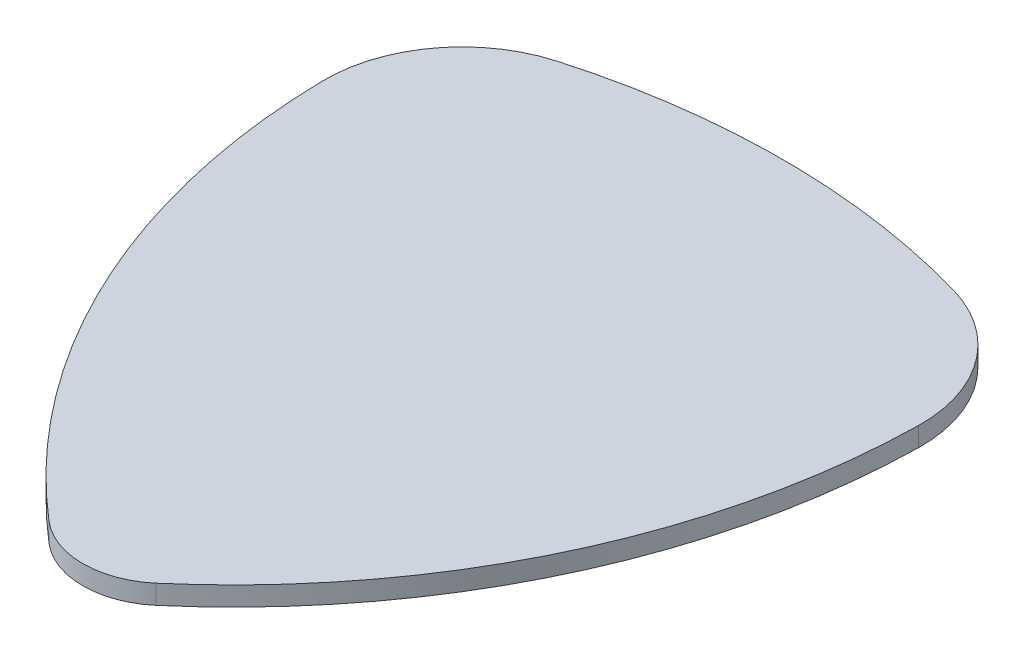
ISO-10303-21;
HEADER;
FILE_DESCRIPTION(('STEP AP214'),'2;1');
FILE_NAME('part.step','',(''),(''),'','','');
FILE_SCHEMA(('AUTOMOTIVE_DESIGN { 1 0 10303 214 1 1 1 1 }'));
ENDSEC;
DATA;
#1=APPLICATION_CONTEXT('core data for automotive mechanical design processes');
#2=APPLICATION_PROTOCOL_DEFINITION('international standard','automotive_design',2000,#1);
#3=PRODUCT_CONTEXT('',#1,'mechanical');
#4=PRODUCT('Part','Part','',(#3));
#5=PRODUCT_RELATED_PRODUCT_CATEGORY('part','',(#4));
#6=PRODUCT_DEFINITION_FORMATION('','',#4);
#7=PRODUCT_DEFINITION_CONTEXT('part definition',#1,'design');
#8=PRODUCT_DEFINITION('design','',#6,#7);
#9=PRODUCT_DEFINITION_SHAPE('','',#8);
#10=(LENGTH_UNIT() NAMED_UNIT(*) SI_UNIT(.MILLI.,.METRE.));
#11=(NAMED_UNIT(*) PLANE_ANGLE_UNIT() SI_UNIT($,.RADIAN.));
#12=(NAMED_UNIT(*) SI_UNIT($,.STERADIAN.) SOLID_ANGLE_UNIT());
#13=UNCERTAINTY_MEASURE_WITH_UNIT(LENGTH_MEASURE(1.E-05),#10,'distance_accuracy_value','');
#14=(GEOMETRIC_REPRESENTATION_CONTEXT(3) GLOBAL_UNCERTAINTY_ASSIGNED_CONTEXT((#13)) GLOBAL_UNIT_ASSIGNED_CONTEXT((#10,
#11,#12)) REPRESENTATION_CONTEXT('',''));
#15=CARTESIAN_POINT('',(0.,0.,0.));
#16=DIRECTION('',(0.,0.,1.));
#17=DIRECTION('',(1.,0.,0.));
#18=AXIS2_PLACEMENT_3D('',#15,#16,#17);
#19=CARTESIAN_POINT('',(28.0686505742078,0.77,2.07575299796898));
#20=DIRECTION('',(0.,-1.,0.));
#21=DIRECTION('',(0.,0.,-1.));
#22=AXIS2_PLACEMENT_3D('',#19,#20,#21);
#23=CYLINDRICAL_SURFACE('',#22,30.4413324660989);
#24=CARTESIAN_POINT('',(28.0686505742078,-0.07,2.07575299796898));
#25=DIRECTION('',(0.,1.,0.));
#26=DIRECTION('',(0.,0.,1.));
#27=AXIS2_PLACEMENT_3D('',#24,#25,#26);
#28=CIRCLE('',#27,30.4413324660989);
#29=CARTESIAN_POINT('',(-2.36769348749957,-0.07,2.62682692126694));
#30=VERTEX_POINT('',#29);
#31=CARTESIAN_POINT('',(8.31566643750851,-0.07,25.2381004611877));
#32=VERTEX_POINT('',#31);
#33=EDGE_CURVE('E113',#30,#32,#28,.T.);
#34=ORIENTED_EDGE('',*,*,#33,.T.);
#35=DIRECTION('',(0.,-1.,0.));
#36=VECTOR('',#35,1.);
#37=CARTESIAN_POINT('',(8.3156664375085,0.77,25.2381004611877));
#38=LINE('',#37,#36);
#39=CARTESIAN_POINT('',(8.31566643750851,0.77,25.2381004611877));
#40=VERTEX_POINT('',#39);
#41=EDGE_CURVE('E42',#32,#40,#38,.F.);
#42=ORIENTED_EDGE('',*,*,#41,.T.);
#43=CARTESIAN_POINT('',(28.0686505742078,0.77,2.07575299796898));
#44=DIRECTION('',(0.,1.,0.));
#45=DIRECTION('',(0.,0.,1.));
#46=AXIS2_PLACEMENT_3D('',#43,#44,#45);
#47=CIRCLE('',#46,30.4413324660989);
#48=CARTESIAN_POINT('',(-2.36769348749957,0.77,2.62682692126694));
#49=VERTEX_POINT('',#48);
#50=EDGE_CURVE('E108',#49,#40,#47,.T.);
#51=ORIENTED_EDGE('',*,*,#50,.F.);
#52=DIRECTION('',(0.,-1.,0.));
#53=VECTOR('',#52,1.);
#54=CARTESIAN_POINT('',(-2.36769348749957,0.77,2.62682692126694));
#55=LINE('',#54,#53);
#56=EDGE_CURVE('E120',#49,#30,#55,.T.);
#57=ORIENTED_EDGE('',*,*,#56,.T.);
#58=EDGE_LOOP('',(#34,#42,#51,#57));
#59=FACE_BOUND('',#58,.T.);
#60=ADVANCED_FACE('F34',(#59),#23,.T.);
#61=CARTESIAN_POINT('',(-6.7653314797104,0.77,2.07575299796898));
#62=DIRECTION('',(0.,-1.,0.));
#63=DIRECTION('',(0.,0.,-1.));
#64=AXIS2_PLACEMENT_3D('',#61,#62,#63);
#65=CYLINDRICAL_SURFACE('',#64,30.4413324660989);
#66=CARTESIAN_POINT('',(-6.7653314797104,0.77,2.07575299796898));
#67=DIRECTION('',(0.,1.,0.));
#68=DIRECTION('',(0.,0.,-1.));
#69=AXIS2_PLACEMENT_3D('',#66,#67,#68);
#70=CIRCLE('',#69,30.4413324660989);
#71=CARTESIAN_POINT('',(12.9876526569889,0.77,25.2381004611877));
#72=VERTEX_POINT('',#71);
#73=CARTESIAN_POINT('',(23.671012581997,0.77,2.62682692126694));
#74=VERTEX_POINT('',#73);
#75=EDGE_CURVE('E111',#72,#74,#70,.T.);
#76=ORIENTED_EDGE('',*,*,#75,.F.);
#77=DIRECTION('',(0.,-1.,0.));
#78=VECTOR('',#77,1.);
#79=CARTESIAN_POINT('',(12.9876526569889,0.77,25.2381004611877));
#80=LINE('',#79,#78);
#81=CARTESIAN_POINT('',(12.9876526569889,-0.07,25.2381004611877));
#82=VERTEX_POINT('',#81);
#83=EDGE_CURVE('E128',#72,#82,#80,.T.);
#84=ORIENTED_EDGE('',*,*,#83,.T.);
#85=CARTESIAN_POINT('',(-6.7653314797104,-0.07,2.07575299796898));
#86=DIRECTION('',(0.,1.,0.));
#87=DIRECTION('',(0.,0.,-1.));
#88=AXIS2_PLACEMENT_3D('',#85,#86,#87);
#89=CIRCLE('',#88,30.4413324660989);
#90=CARTESIAN_POINT('',(23.671012581997,-0.07,2.62682692126694));
#91=VERTEX_POINT('',#90);
#92=EDGE_CURVE('E109',#82,#91,#89,.T.);
#93=ORIENTED_EDGE('',*,*,#92,.T.);
#94=DIRECTION('',(0.,-1.,0.));
#95=VECTOR('',#94,1.);
#96=CARTESIAN_POINT('',(23.671012581997,0.77,2.62682692126694));
#97=LINE('',#96,#95);
#98=EDGE_CURVE('E94',#91,#74,#97,.F.);
#99=ORIENTED_EDGE('',*,*,#98,.T.);
#100=EDGE_LOOP('',(#76,#84,#93,#99));
#101=FACE_BOUND('',#100,.T.);
#102=ADVANCED_FACE('F134',(#101),#65,.T.);
#103=CARTESIAN_POINT('',(10.6516595472487,0.77,27.0421933905919));
#104=DIRECTION('',(0.,-1.,0.));
#105=DIRECTION('',(0.,0.,-1.));
#106=AXIS2_PLACEMENT_3D('',#103,#104,#105);
#107=CYLINDRICAL_SURFACE('',#106,31.5090353009912);
#108=CARTESIAN_POINT('',(10.6516595472487,-0.07,27.0421933905919));
#109=DIRECTION('',(0.,1.,0.));
#110=DIRECTION('',(0.,0.,-1.));
#111=AXIS2_PLACEMENT_3D('',#108,#109,#110);
#112=CIRCLE('',#111,31.5090353009912);
#113=CARTESIAN_POINT('',(19.3232545394361,-0.07,-3.25009516426281));
#114=VERTEX_POINT('',#113);
#115=CARTESIAN_POINT('',(1.98006455506132,-0.07,-3.25009516426281));
#116=VERTEX_POINT('',#115);
#117=EDGE_CURVE('E101',#114,#116,#112,.T.);
#118=ORIENTED_EDGE('',*,*,#117,.T.);
#119=DIRECTION('',(0.,-1.,0.));
#120=VECTOR('',#119,1.);
#121=CARTESIAN_POINT('',(1.98006455506132,0.77,-3.25009516426281));
#122=LINE('',#121,#120);
#123=CARTESIAN_POINT('',(1.98006455506132,0.77,-3.25009516426281));
#124=VERTEX_POINT('',#123);
#125=EDGE_CURVE('E124',#116,#124,#122,.F.);
#126=ORIENTED_EDGE('',*,*,#125,.T.);
#127=CARTESIAN_POINT('',(10.6516595472487,0.77,27.0421933905919));
#128=DIRECTION('',(0.,1.,0.));
#129=DIRECTION('',(0.,0.,-1.));
#130=AXIS2_PLACEMENT_3D('',#127,#128,#129);
#131=CIRCLE('',#130,31.5090353009912);
#132=CARTESIAN_POINT('',(19.3232545394361,0.77,-3.25009516426281));
#133=VERTEX_POINT('',#132);
#134=EDGE_CURVE('E104',#133,#124,#131,.T.);
#135=ORIENTED_EDGE('',*,*,#134,.F.);
#136=DIRECTION('',(0.,-1.,0.));
#137=VECTOR('',#136,1.);
#138=CARTESIAN_POINT('',(19.3232545394361,0.77,-3.25009516426281));
#139=LINE('',#138,#137);
#140=EDGE_CURVE('E92',#133,#114,#139,.T.);
#141=ORIENTED_EDGE('',*,*,#140,.T.);
#142=EDGE_LOOP('',(#118,#126,#135,#141));
#143=FACE_BOUND('',#142,.T.);
#144=ADVANCED_FACE('F100',(#143),#107,.T.);
#145=CARTESIAN_POINT('',(10.6516595472487,0.77,2.07575299796898));
#146=DIRECTION('',(0.,1.,0.));
#147=DIRECTION('',(0.,0.,1.));
#148=AXIS2_PLACEMENT_3D('',#145,#146,#147);
#149=PLANE('',#148);
#150=ORIENTED_EDGE('',*,*,#50,.T.);
#151=CARTESIAN_POINT('',(10.6516595472487,0.77,22.4989151459441));
#152=DIRECTION('',(0.,1.,0.));
#153=DIRECTION('',(0.,0.,1.));
#154=AXIS2_PLACEMENT_3D('',#151,#152,#153);
#155=CIRCLE('',#154,3.6);
#156=EDGE_CURVE('E11',#40,#72,#155,.T.);
#157=ORIENTED_EDGE('',*,*,#156,.T.);
#158=ORIENTED_EDGE('',*,*,#75,.T.);
#159=CARTESIAN_POINT('',(17.6719957986936,0.77,2.51821000893335));
#160=DIRECTION('',(0.,1.,0.));
#161=DIRECTION('',(0.,0.,1.));
#162=AXIS2_PLACEMENT_3D('',#159,#160,#161);
#163=CIRCLE('',#162,6.);
#164=EDGE_CURVE('E118',#74,#133,#163,.T.);
#165=ORIENTED_EDGE('',*,*,#164,.T.);
#166=ORIENTED_EDGE('',*,*,#134,.T.);
#167=CARTESIAN_POINT('',(3.63132329580378,0.77,2.51821000893336));
#168=DIRECTION('',(0.,1.,0.));
#169=DIRECTION('',(0.,0.,1.));
#170=AXIS2_PLACEMENT_3D('',#167,#168,#169);
#171=CIRCLE('',#170,6.);
#172=EDGE_CURVE('E126',#124,#49,#171,.T.);
#173=ORIENTED_EDGE('',*,*,#172,.T.);
#174=EDGE_LOOP('',(#150,#157,#158,#165,#166,#173));
#175=FACE_BOUND('',#174,.T.);
#176=ADVANCED_FACE('F138',(#175),#149,.T.);
#177=CARTESIAN_POINT('',(10.6516595472487,-0.07,2.07575299796898));
#178=DIRECTION('',(0.,1.,0.));
#179=DIRECTION('',(0.,0.,1.));
#180=AXIS2_PLACEMENT_3D('',#177,#178,#179);
#181=PLANE('',#180);
#182=ORIENTED_EDGE('',*,*,#92,.F.);
#183=CARTESIAN_POINT('',(10.6516595472487,-0.07,22.4989151459441));
#184=DIRECTION('',(0.,1.,0.));
#185=DIRECTION('',(0.,0.,1.));
#186=AXIS2_PLACEMENT_3D('',#183,#184,#185);
#187=CIRCLE('',#186,3.6);
#188=EDGE_CURVE('E56',#82,#32,#187,.F.);
#189=ORIENTED_EDGE('',*,*,#188,.T.);
#190=ORIENTED_EDGE('',*,*,#33,.F.);
#191=CARTESIAN_POINT('',(3.63132329580378,-0.07,2.51821000893336));
#192=DIRECTION('',(0.,1.,0.));
#193=DIRECTION('',(0.,0.,1.));
#194=AXIS2_PLACEMENT_3D('',#191,#192,#193);
#195=CIRCLE('',#194,6.);
#196=EDGE_CURVE('E107',#30,#116,#195,.F.);
#197=ORIENTED_EDGE('',*,*,#196,.T.);
#198=ORIENTED_EDGE('',*,*,#117,.F.);
#199=CARTESIAN_POINT('',(17.6719957986936,-0.07,2.51821000893335));
#200=DIRECTION('',(0.,1.,0.));
#201=DIRECTION('',(0.,0.,1.));
#202=AXIS2_PLACEMENT_3D('',#199,#200,#201);
#203=CIRCLE('',#202,6.);
#204=EDGE_CURVE('E88',#114,#91,#203,.F.);
#205=ORIENTED_EDGE('',*,*,#204,.T.);
#206=EDGE_LOOP('',(#182,#189,#190,#197,#198,#205));
#207=FACE_BOUND('',#206,.T.);
#208=ADVANCED_FACE('F106',(#207),#181,.F.);
#209=CARTESIAN_POINT('',(17.6719957986936,0.77,2.51821000893335));
#210=DIRECTION('',(0.,-1.,0.));
#211=DIRECTION('',(0.,0.,-1.));
#212=AXIS2_PLACEMENT_3D('',#209,#210,#211);
#213=CYLINDRICAL_SURFACE('',#212,6.);
#214=ORIENTED_EDGE('',*,*,#164,.F.);
#215=ORIENTED_EDGE('',*,*,#98,.F.);
#216=ORIENTED_EDGE('',*,*,#204,.F.);
#217=ORIENTED_EDGE('',*,*,#140,.F.);
#218=EDGE_LOOP('',(#214,#215,#216,#217));
#219=FACE_BOUND('',#218,.T.);
#220=ADVANCED_FACE('F91',(#219),#213,.T.);
#221=CARTESIAN_POINT('',(3.63132329580378,0.77,2.51821000893336));
#222=DIRECTION('',(0.,-1.,0.));
#223=DIRECTION('',(0.,0.,-1.));
#224=AXIS2_PLACEMENT_3D('',#221,#222,#223);
#225=CYLINDRICAL_SURFACE('',#224,6.);
#226=ORIENTED_EDGE('',*,*,#172,.F.);
#227=ORIENTED_EDGE('',*,*,#125,.F.);
#228=ORIENTED_EDGE('',*,*,#196,.F.);
#229=ORIENTED_EDGE('',*,*,#56,.F.);
#230=EDGE_LOOP('',(#226,#227,#228,#229));
#231=FACE_BOUND('',#230,.T.);
#232=ADVANCED_FACE('F142',(#231),#225,.T.);
#233=CARTESIAN_POINT('',(10.6516595472487,0.77,22.4989151459441));
#234=DIRECTION('',(0.,-1.,0.));
#235=DIRECTION('',(0.,0.,-1.));
#236=AXIS2_PLACEMENT_3D('',#233,#234,#235);
#237=CYLINDRICAL_SURFACE('',#236,3.6);
#238=ORIENTED_EDGE('',*,*,#156,.F.);
#239=ORIENTED_EDGE('',*,*,#41,.F.);
#240=ORIENTED_EDGE('',*,*,#188,.F.);
#241=ORIENTED_EDGE('',*,*,#83,.F.);
#242=EDGE_LOOP('',(#238,#239,#240,#241));
#243=FACE_BOUND('',#242,.T.);
#244=ADVANCED_FACE('F36',(#243),#237,.T.);
#245=CLOSED_SHELL('',(#60,#102,#144,#176,#208,#220,#232,#244));
#246=MANIFOLD_SOLID_BREP('B2',#245);
#247=ADVANCED_BREP_SHAPE_REPRESENTATION('',(#18,#246),#14);
#248=SHAPE_DEFINITION_REPRESENTATION(#9,#247);
ENDSEC;
END-ISO-10303-21;
